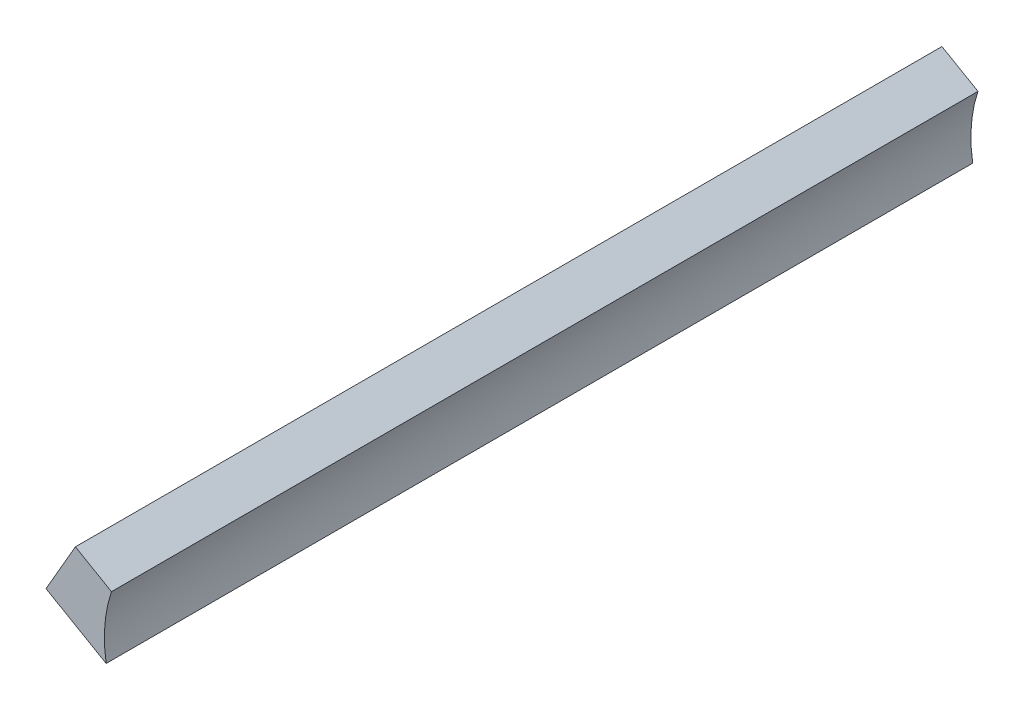
ISO-10303-21;
HEADER;
FILE_DESCRIPTION(('STEP AP214'),'2;1');
FILE_NAME('part.step','',(''),(''),'','','');
FILE_SCHEMA(('AUTOMOTIVE_DESIGN { 1 0 10303 214 1 1 1 1 }'));
ENDSEC;
DATA;
#1=APPLICATION_CONTEXT('core data for automotive mechanical design processes');
#2=APPLICATION_PROTOCOL_DEFINITION('international standard','automotive_design',2000,#1);
#3=PRODUCT_CONTEXT('',#1,'mechanical');
#4=PRODUCT('Part','Part','',(#3));
#5=PRODUCT_RELATED_PRODUCT_CATEGORY('part','',(#4));
#6=PRODUCT_DEFINITION_FORMATION('','',#4);
#7=PRODUCT_DEFINITION_CONTEXT('part definition',#1,'design');
#8=PRODUCT_DEFINITION('design','',#6,#7);
#9=PRODUCT_DEFINITION_SHAPE('','',#8);
#10=(LENGTH_UNIT() NAMED_UNIT(*) SI_UNIT(.MILLI.,.METRE.));
#11=(NAMED_UNIT(*) PLANE_ANGLE_UNIT() SI_UNIT($,.RADIAN.));
#12=(NAMED_UNIT(*) SI_UNIT($,.STERADIAN.) SOLID_ANGLE_UNIT());
#13=UNCERTAINTY_MEASURE_WITH_UNIT(LENGTH_MEASURE(1.E-05),#10,'distance_accuracy_value','');
#14=(GEOMETRIC_REPRESENTATION_CONTEXT(3) GLOBAL_UNCERTAINTY_ASSIGNED_CONTEXT((#13)) GLOBAL_UNIT_ASSIGNED_CONTEXT((#10,
#11,#12)) REPRESENTATION_CONTEXT('',''));
#15=CARTESIAN_POINT('',(0.,0.,0.));
#16=DIRECTION('',(0.,0.,1.));
#17=DIRECTION('',(1.,0.,0.));
#18=AXIS2_PLACEMENT_3D('',#15,#16,#17);
#19=CARTESIAN_POINT('',(287.283668248315,598.671970667876,1126.34727675431));
#20=DIRECTION('',(0.866025403784437,-0.500000000000004,0.));
#21=DIRECTION('',(0.500000000000004,0.866025403784437,0.));
#22=AXIS2_PLACEMENT_3D('',#19,#20,#21);
#23=PLANE('',#22);
#24=CARTESIAN_POINT('',(277.838019055995,582.311626356306,621.747183513771));
#25=DIRECTION('',(-0.866025403784437,0.500000000000004,0.));
#26=DIRECTION('',(-0.500000000000004,-0.866025403784437,0.));
#27=AXIS2_PLACEMENT_3D('',#24,#25,#26);
#28=CIRCLE('',#27,6.34999999999994);
#29=CARTESIAN_POINT('',(274.663019055995,576.812365042275,621.747183513771));
#30=VERTEX_POINT('',#29);
#31=EDGE_CURVE('E116',#30,#30,#28,.T.);
#32=ORIENTED_EDGE('',*,*,#31,.F.);
#33=EDGE_LOOP('',(#32));
#34=FACE_BOUND('',#33,.T.);
#35=CARTESIAN_POINT('',(277.838019055996,582.311626356307,929.595183513771));
#36=DIRECTION('',(-0.866025403784437,0.500000000000004,0.));
#37=DIRECTION('',(-0.500000000000004,-0.866025403784437,0.));
#38=AXIS2_PLACEMENT_3D('',#35,#36,#37);
#39=CIRCLE('',#38,6.34999999999994);
#40=CARTESIAN_POINT('',(274.663019055996,576.812365042276,929.595183513771));
#41=VERTEX_POINT('',#40);
#42=EDGE_CURVE('E122',#41,#41,#39,.T.);
#43=ORIENTED_EDGE('',*,*,#42,.F.);
#44=EDGE_LOOP('',(#43));
#45=FACE_BOUND('',#44,.T.);
#46=CARTESIAN_POINT('',(277.838019055996,582.311626356307,775.671183513771));
#47=DIRECTION('',(-0.866025403784437,0.500000000000004,0.));
#48=DIRECTION('',(-0.500000000000004,-0.866025403784437,0.));
#49=AXIS2_PLACEMENT_3D('',#46,#47,#48);
#50=CIRCLE('',#49,6.34999999999994);
#51=CARTESIAN_POINT('',(274.663019055996,576.812365042276,775.671183513771));
#52=VERTEX_POINT('',#51);
#53=EDGE_CURVE('E110',#52,#52,#50,.T.);
#54=ORIENTED_EDGE('',*,*,#53,.F.);
#55=EDGE_LOOP('',(#54));
#56=FACE_BOUND('',#55,.T.);
#57=DIRECTION('',(-0.500000000000004,-0.866025403784437,0.));
#58=VECTOR('',#57,1.);
#59=CARTESIAN_POINT('',(287.283668248315,598.671970667876,1056.50385266952));
#60=LINE('',#59,#58);
#61=CARTESIAN_POINT('',(287.283668248315,598.671970667876,1056.50385266952));
#62=VERTEX_POINT('',#61);
#63=CARTESIAN_POINT('',(268.233668248315,565.676402783689,1056.50385266952));
#64=VERTEX_POINT('',#63);
#65=EDGE_CURVE('E86',#62,#64,#60,.T.);
#66=ORIENTED_EDGE('',*,*,#65,.F.);
#67=DIRECTION('',(0.,0.,-1.));
#68=VECTOR('',#67,1.);
#69=CARTESIAN_POINT('',(287.283668248315,598.671970667876,1126.34727675431));
#70=LINE('',#69,#68);
#71=CARTESIAN_POINT('',(287.283668248315,598.671970667876,495.163852669516));
#72=VERTEX_POINT('',#71);
#73=EDGE_CURVE('E37',#62,#72,#70,.T.);
#74=ORIENTED_EDGE('',*,*,#73,.T.);
#75=DIRECTION('',(-0.500000000000004,-0.866025403784437,0.));
#76=VECTOR('',#75,1.);
#77=CARTESIAN_POINT('',(287.283668248315,598.671970667876,495.163852669516));
#78=LINE('',#77,#76);
#79=CARTESIAN_POINT('',(268.233668248315,565.676402783689,495.163852669516));
#80=VERTEX_POINT('',#79);
#81=EDGE_CURVE('E84',#72,#80,#78,.T.);
#82=ORIENTED_EDGE('',*,*,#81,.T.);
#83=DIRECTION('',(0.,0.,-1.));
#84=VECTOR('',#83,1.);
#85=CARTESIAN_POINT('',(268.233668248315,565.676402783689,1126.34727675431));
#86=LINE('',#85,#84);
#87=EDGE_CURVE('E72',#64,#80,#86,.T.);
#88=ORIENTED_EDGE('',*,*,#87,.F.);
#89=EDGE_LOOP('',(#66,#74,#82,#88));
#90=FACE_BOUND('',#89,.T.);
#91=ADVANCED_FACE('F33',(#34,#45,#56,#90),#23,.F.);
#92=CARTESIAN_POINT('',(268.233668248315,565.676402783689,1126.34727675431));
#93=DIRECTION('',(0.499987844208222,0.866032421820347,0.));
#94=DIRECTION('',(-0.866032421820347,0.499987844208222,0.));
#95=AXIS2_PLACEMENT_3D('',#92,#93,#94);
#96=PLANE('',#95);
#97=DIRECTION('',(0.866032421820347,-0.499987844208222,0.));
#98=VECTOR('',#97,1.);
#99=CARTESIAN_POINT('',(268.233668248315,565.676402783689,1056.50385266952));
#100=LINE('',#99,#98);
#101=CARTESIAN_POINT('',(307.203792994598,543.177720090651,1056.50385266952));
#102=VERTEX_POINT('',#101);
#103=EDGE_CURVE('E42',#64,#102,#100,.T.);
#104=ORIENTED_EDGE('',*,*,#103,.F.);
#105=ORIENTED_EDGE('',*,*,#87,.T.);
#106=DIRECTION('',(0.866032421820347,-0.499987844208222,0.));
#107=VECTOR('',#106,1.);
#108=CARTESIAN_POINT('',(268.233668248315,565.676402783689,495.163852669516));
#109=LINE('',#108,#107);
#110=CARTESIAN_POINT('',(307.203792994598,543.177720090651,495.163852669516));
#111=VERTEX_POINT('',#110);
#112=EDGE_CURVE('E92',#80,#111,#109,.T.);
#113=ORIENTED_EDGE('',*,*,#112,.T.);
#114=DIRECTION('',(0.,0.,-1.));
#115=VECTOR('',#114,1.);
#116=CARTESIAN_POINT('',(307.203792994598,543.177720090651,1126.34727675431));
#117=LINE('',#116,#115);
#118=EDGE_CURVE('E77',#102,#111,#117,.T.);
#119=ORIENTED_EDGE('',*,*,#118,.F.);
#120=EDGE_LOOP('',(#104,#105,#113,#119));
#121=FACE_BOUND('',#120,.T.);
#122=ADVANCED_FACE('F107',(#121),#96,.F.);
#123=CARTESIAN_POINT('',(392.915001612522,557.307056283656,1126.34727675431));
#124=DIRECTION('',(0.,0.,-1.));
#125=DIRECTION('',(-1.,0.,0.));
#126=AXIS2_PLACEMENT_3D('',#123,#124,#125);
#127=CYLINDRICAL_SURFACE('',#126,86.8680000000016);
#128=CARTESIAN_POINT('',(392.915001612522,557.307056283656,1056.50385266952));
#129=DIRECTION('',(0.,0.,1.));
#130=DIRECTION('',(1.,0.,0.));
#131=AXIS2_PLACEMENT_3D('',#128,#129,#130);
#132=CIRCLE('',#131,86.8680000000016);
#133=CARTESIAN_POINT('',(310.642299925849,585.186295533965,1056.50385266952));
#134=VERTEX_POINT('',#133);
#135=EDGE_CURVE('E11',#102,#134,#132,.F.);
#136=ORIENTED_EDGE('',*,*,#135,.F.);
#137=ORIENTED_EDGE('',*,*,#118,.T.);
#138=CARTESIAN_POINT('',(392.915001612522,557.307056283656,495.163852669516));
#139=DIRECTION('',(0.,0.,-1.));
#140=DIRECTION('',(-1.,0.,0.));
#141=AXIS2_PLACEMENT_3D('',#138,#139,#140);
#142=CIRCLE('',#141,86.8680000000016);
#143=CARTESIAN_POINT('',(310.642299925849,585.186295533965,495.163852669516));
#144=VERTEX_POINT('',#143);
#145=EDGE_CURVE('E95',#111,#144,#142,.T.);
#146=ORIENTED_EDGE('',*,*,#145,.T.);
#147=DIRECTION('',(0.,0.,-1.));
#148=VECTOR('',#147,1.);
#149=CARTESIAN_POINT('',(310.642299925849,585.186295533965,1126.34727675431));
#150=LINE('',#149,#148);
#151=EDGE_CURVE('E58',#134,#144,#150,.T.);
#152=ORIENTED_EDGE('',*,*,#151,.F.);
#153=EDGE_LOOP('',(#136,#137,#146,#152));
#154=FACE_BOUND('',#153,.T.);
#155=ADVANCED_FACE('F106',(#154),#127,.F.);
#156=CARTESIAN_POINT('',(287.283668248315,598.671970667876,1126.34727675431));
#157=DIRECTION('',(-0.499987844208223,-0.866032421820346,0.));
#158=DIRECTION('',(0.866032421820346,-0.499987844208223,0.));
#159=AXIS2_PLACEMENT_3D('',#156,#157,#158);
#160=PLANE('',#159);
#161=DIRECTION('',(-0.866032421820346,0.499987844208223,0.));
#162=VECTOR('',#161,1.);
#163=CARTESIAN_POINT('',(287.283668248315,598.671970667876,1056.50385266952));
#164=LINE('',#163,#162);
#165=EDGE_CURVE('E102',#134,#62,#164,.T.);
#166=ORIENTED_EDGE('',*,*,#165,.F.);
#167=ORIENTED_EDGE('',*,*,#151,.T.);
#168=DIRECTION('',(-0.866032421820346,0.499987844208223,0.));
#169=VECTOR('',#168,1.);
#170=CARTESIAN_POINT('',(287.283668248315,598.671970667876,495.163852669516));
#171=LINE('',#170,#169);
#172=EDGE_CURVE('E91',#144,#72,#171,.T.);
#173=ORIENTED_EDGE('',*,*,#172,.T.);
#174=ORIENTED_EDGE('',*,*,#73,.F.);
#175=EDGE_LOOP('',(#166,#167,#173,#174));
#176=FACE_BOUND('',#175,.T.);
#177=ADVANCED_FACE('F94',(#176),#160,.F.);
#178=CARTESIAN_POINT('',(37.2646930590061,699.026402783689,1056.50385266952));
#179=DIRECTION('',(0.,0.,1.));
#180=DIRECTION('',(1.,0.,0.));
#181=AXIS2_PLACEMENT_3D('',#178,#179,#180);
#182=PLANE('',#181);
#183=ORIENTED_EDGE('',*,*,#165,.T.);
#184=ORIENTED_EDGE('',*,*,#65,.T.);
#185=ORIENTED_EDGE('',*,*,#103,.T.);
#186=ORIENTED_EDGE('',*,*,#135,.T.);
#187=EDGE_LOOP('',(#183,#184,#185,#186));
#188=FACE_BOUND('',#187,.T.);
#189=ADVANCED_FACE('F35',(#188),#182,.T.);
#190=CARTESIAN_POINT('',(37.2646930590064,699.026402783689,495.163852669516));
#191=DIRECTION('',(0.,0.,-1.));
#192=DIRECTION('',(-1.,0.,0.));
#193=AXIS2_PLACEMENT_3D('',#190,#191,#192);
#194=PLANE('',#193);
#195=ORIENTED_EDGE('',*,*,#81,.F.);
#196=ORIENTED_EDGE('',*,*,#172,.F.);
#197=ORIENTED_EDGE('',*,*,#145,.F.);
#198=ORIENTED_EDGE('',*,*,#112,.F.);
#199=EDGE_LOOP('',(#195,#196,#197,#198));
#200=FACE_BOUND('',#199,.T.);
#201=ADVANCED_FACE('F90',(#200),#194,.T.);
#202=CARTESIAN_POINT('',(294.2925017279,572.811626356307,775.671183513771));
#203=DIRECTION('',(-0.866025403784437,0.500000000000003,0.));
#204=DIRECTION('',(-0.500000000000003,-0.866025403784437,0.));
#205=AXIS2_PLACEMENT_3D('',#202,#203,#204);
#206=CYLINDRICAL_SURFACE('',#205,6.34999999999994);
#207=CARTESIAN_POINT('',(294.2925017279,572.811626356307,775.671183513771));
#208=DIRECTION('',(-0.866025403784437,0.500000000000004,0.));
#209=DIRECTION('',(-0.500000000000004,-0.866025403784437,0.));
#210=AXIS2_PLACEMENT_3D('',#207,#208,#209);
#211=CIRCLE('',#210,6.34999999999994);
#212=CARTESIAN_POINT('',(291.1175017279,567.312365042276,775.671183513771));
#213=VERTEX_POINT('',#212);
#214=EDGE_CURVE('E108',#213,#213,#211,.T.);
#215=ORIENTED_EDGE('',*,*,#214,.F.);
#216=EDGE_LOOP('',(#215));
#217=FACE_BOUND('',#216,.T.);
#218=ORIENTED_EDGE('',*,*,#53,.T.);
#219=EDGE_LOOP('',(#218));
#220=FACE_BOUND('',#219,.T.);
#221=ADVANCED_FACE('F142',(#217,#220),#206,.F.);
#222=CARTESIAN_POINT('',(294.2925017279,572.811626356307,775.671183513771));
#223=DIRECTION('',(-0.866025403784437,0.500000000000004,0.));
#224=DIRECTION('',(-0.500000000000004,-0.866025403784437,0.));
#225=AXIS2_PLACEMENT_3D('',#222,#223,#224);
#226=PLANE('',#225);
#227=ORIENTED_EDGE('',*,*,#214,.T.);
#228=EDGE_LOOP('',(#227));
#229=FACE_BOUND('',#228,.T.);
#230=ADVANCED_FACE('F133',(#229),#226,.T.);
#231=CARTESIAN_POINT('',(294.2925017279,572.811626356307,929.595183513771));
#232=DIRECTION('',(-0.866025403784437,0.500000000000003,0.));
#233=DIRECTION('',(-0.500000000000003,-0.866025403784437,0.));
#234=AXIS2_PLACEMENT_3D('',#231,#232,#233);
#235=CYLINDRICAL_SURFACE('',#234,6.34999999999994);
#236=CARTESIAN_POINT('',(294.2925017279,572.811626356307,929.595183513771));
#237=DIRECTION('',(-0.866025403784437,0.500000000000004,0.));
#238=DIRECTION('',(-0.500000000000004,-0.866025403784437,0.));
#239=AXIS2_PLACEMENT_3D('',#236,#237,#238);
#240=CIRCLE('',#239,6.34999999999994);
#241=CARTESIAN_POINT('',(291.1175017279,567.312365042276,929.595183513771));
#242=VERTEX_POINT('',#241);
#243=EDGE_CURVE('E114',#242,#242,#240,.T.);
#244=ORIENTED_EDGE('',*,*,#243,.F.);
#245=EDGE_LOOP('',(#244));
#246=FACE_BOUND('',#245,.T.);
#247=ORIENTED_EDGE('',*,*,#42,.T.);
#248=EDGE_LOOP('',(#247));
#249=FACE_BOUND('',#248,.T.);
#250=ADVANCED_FACE('F130',(#246,#249),#235,.F.);
#251=CARTESIAN_POINT('',(294.2925017279,572.811626356307,929.595183513771));
#252=DIRECTION('',(-0.866025403784437,0.500000000000004,0.));
#253=DIRECTION('',(-0.500000000000004,-0.866025403784437,0.));
#254=AXIS2_PLACEMENT_3D('',#251,#252,#253);
#255=PLANE('',#254);
#256=ORIENTED_EDGE('',*,*,#243,.T.);
#257=EDGE_LOOP('',(#256));
#258=FACE_BOUND('',#257,.T.);
#259=ADVANCED_FACE('F128',(#258),#255,.T.);
#260=CARTESIAN_POINT('',(294.292501727899,572.811626356306,621.747183513771));
#261=DIRECTION('',(-0.866025403784437,0.500000000000003,0.));
#262=DIRECTION('',(-0.500000000000003,-0.866025403784437,0.));
#263=AXIS2_PLACEMENT_3D('',#260,#261,#262);
#264=CYLINDRICAL_SURFACE('',#263,6.34999999999994);
#265=CARTESIAN_POINT('',(294.292501727899,572.811626356306,621.747183513771));
#266=DIRECTION('',(-0.866025403784437,0.500000000000004,0.));
#267=DIRECTION('',(-0.500000000000004,-0.866025403784437,0.));
#268=AXIS2_PLACEMENT_3D('',#265,#266,#267);
#269=CIRCLE('',#268,6.34999999999994);
#270=CARTESIAN_POINT('',(291.117501727899,567.312365042275,621.747183513771));
#271=VERTEX_POINT('',#270);
#272=EDGE_CURVE('E119',#271,#271,#269,.T.);
#273=ORIENTED_EDGE('',*,*,#272,.F.);
#274=EDGE_LOOP('',(#273));
#275=FACE_BOUND('',#274,.T.);
#276=ORIENTED_EDGE('',*,*,#31,.T.);
#277=EDGE_LOOP('',(#276));
#278=FACE_BOUND('',#277,.T.);
#279=ADVANCED_FACE('F211',(#275,#278),#264,.F.);
#280=CARTESIAN_POINT('',(294.292501727899,572.811626356306,621.747183513771));
#281=DIRECTION('',(-0.866025403784437,0.500000000000004,0.));
#282=DIRECTION('',(-0.500000000000004,-0.866025403784437,0.));
#283=AXIS2_PLACEMENT_3D('',#280,#281,#282);
#284=PLANE('',#283);
#285=ORIENTED_EDGE('',*,*,#272,.T.);
#286=EDGE_LOOP('',(#285));
#287=FACE_BOUND('',#286,.T.);
#288=ADVANCED_FACE('F220',(#287),#284,.T.);
#289=CLOSED_SHELL('',(#91,#122,#155,#177,#189,#201,#221,#230,#250,#259,#279,#288));
#290=MANIFOLD_SOLID_BREP('B2',#289);
#291=ADVANCED_BREP_SHAPE_REPRESENTATION('',(#18,#290),#14);
#292=SHAPE_DEFINITION_REPRESENTATION(#9,#291);
ENDSEC;
END-ISO-10303-21;
